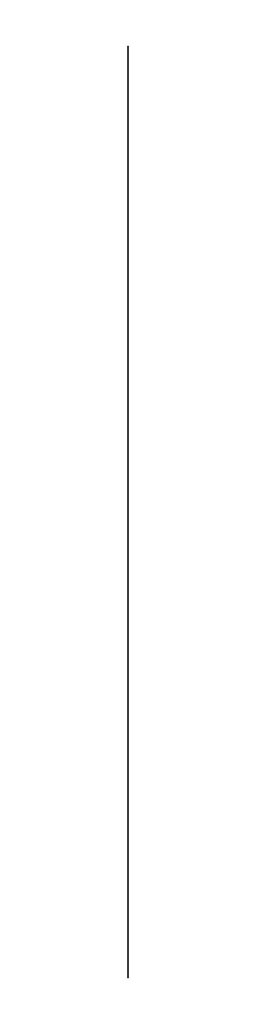
ISO-10303-21;
HEADER;
FILE_DESCRIPTION(('STEP AP214'),'2;1');
FILE_NAME('part.step','',(''),(''),'','','');
FILE_SCHEMA(('AUTOMOTIVE_DESIGN { 1 0 10303 214 1 1 1 1 }'));
ENDSEC;
DATA;
#1=APPLICATION_CONTEXT('core data for automotive mechanical design processes');
#2=APPLICATION_PROTOCOL_DEFINITION('international standard','automotive_design',2000,#1);
#3=PRODUCT_CONTEXT('',#1,'mechanical');
#4=PRODUCT('Part','Part','',(#3));
#5=PRODUCT_RELATED_PRODUCT_CATEGORY('part','',(#4));
#6=PRODUCT_DEFINITION_FORMATION('','',#4);
#7=PRODUCT_DEFINITION_CONTEXT('part definition',#1,'design');
#8=PRODUCT_DEFINITION('design','',#6,#7);
#9=PRODUCT_DEFINITION_SHAPE('','',#8);
#10=(LENGTH_UNIT() NAMED_UNIT(*) SI_UNIT(.MILLI.,.METRE.));
#11=(NAMED_UNIT(*) PLANE_ANGLE_UNIT() SI_UNIT($,.RADIAN.));
#12=(NAMED_UNIT(*) SI_UNIT($,.STERADIAN.) SOLID_ANGLE_UNIT());
#13=UNCERTAINTY_MEASURE_WITH_UNIT(LENGTH_MEASURE(1.E-05),#10,'distance_accuracy_value','');
#14=(GEOMETRIC_REPRESENTATION_CONTEXT(3) GLOBAL_UNCERTAINTY_ASSIGNED_CONTEXT((#13)) GLOBAL_UNIT_ASSIGNED_CONTEXT((#10,
#11,#12)) REPRESENTATION_CONTEXT('',''));
#15=CARTESIAN_POINT('',(0.,0.,0.));
#16=DIRECTION('',(0.,0.,1.));
#17=DIRECTION('',(1.,0.,0.));
#18=AXIS2_PLACEMENT_3D('',#15,#16,#17);
#19=CARTESIAN_POINT('',(0.,12600.,0.));
#20=DIRECTION('',(0.,-1.,0.));
#21=DIRECTION('',(0.,0.,-1.));
#22=AXIS2_PLACEMENT_3D('',#19,#20,#21);
#23=CYLINDRICAL_SURFACE('',#22,3.);
#24=CARTESIAN_POINT('',(0.,12600.,0.));
#25=DIRECTION('',(0.,1.,0.));
#26=DIRECTION('',(0.,0.,1.));
#27=AXIS2_PLACEMENT_3D('',#24,#25,#26);
#28=CIRCLE('',#27,3.);
#29=CARTESIAN_POINT('',(0.,12600.,3.));
#30=VERTEX_POINT('',#29);
#31=EDGE_CURVE('E10',#30,#30,#28,.T.);
#32=ORIENTED_EDGE('',*,*,#31,.F.);
#33=EDGE_LOOP('',(#32));
#34=FACE_BOUND('',#33,.T.);
#35=CARTESIAN_POINT('',(0.,0.,0.));
#36=DIRECTION('',(0.,1.,0.));
#37=DIRECTION('',(0.,0.,1.));
#38=AXIS2_PLACEMENT_3D('',#35,#36,#37);
#39=CIRCLE('',#38,3.);
#40=CARTESIAN_POINT('',(0.,0.,3.));
#41=VERTEX_POINT('',#40);
#42=EDGE_CURVE('E18',#41,#41,#39,.T.);
#43=ORIENTED_EDGE('',*,*,#42,.T.);
#44=EDGE_LOOP('',(#43));
#45=FACE_BOUND('',#44,.T.);
#46=ADVANCED_FACE('F15',(#34,#45),#23,.T.);
#47=CARTESIAN_POINT('',(0.,12600.,0.));
#48=DIRECTION('',(0.,1.,0.));
#49=DIRECTION('',(0.,0.,1.));
#50=AXIS2_PLACEMENT_3D('',#47,#48,#49);
#51=PLANE('',#50);
#52=ORIENTED_EDGE('',*,*,#31,.T.);
#53=EDGE_LOOP('',(#52));
#54=FACE_BOUND('',#53,.T.);
#55=ADVANCED_FACE('F30',(#54),#51,.T.);
#56=CARTESIAN_POINT('',(0.,0.,0.));
#57=DIRECTION('',(0.,1.,0.));
#58=DIRECTION('',(0.,0.,1.));
#59=AXIS2_PLACEMENT_3D('',#56,#57,#58);
#60=PLANE('',#59);
#61=ORIENTED_EDGE('',*,*,#42,.F.);
#62=EDGE_LOOP('',(#61));
#63=FACE_BOUND('',#62,.T.);
#64=ADVANCED_FACE('F28',(#63),#60,.F.);
#65=CLOSED_SHELL('',(#46,#55,#64));
#66=MANIFOLD_SOLID_BREP('B1',#65);
#67=ADVANCED_BREP_SHAPE_REPRESENTATION('',(#18,#66),#14);
#68=SHAPE_DEFINITION_REPRESENTATION(#9,#67);
ENDSEC;
END-ISO-10303-21;
